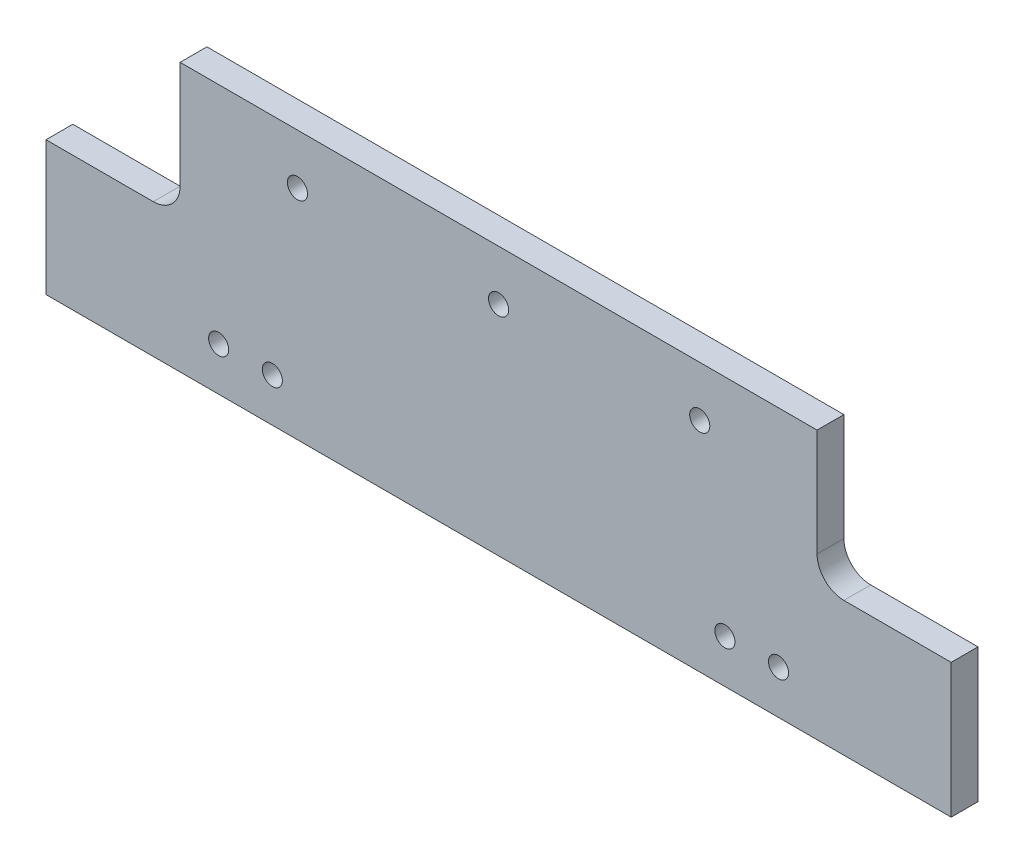
ISO-10303-21;
HEADER;
FILE_DESCRIPTION(('STEP AP214'),'2;1');
FILE_NAME('part.step','',(''),(''),'','','');
FILE_SCHEMA(('AUTOMOTIVE_DESIGN { 1 0 10303 214 1 1 1 1 }'));
ENDSEC;
DATA;
#1=APPLICATION_CONTEXT('core data for automotive mechanical design processes');
#2=APPLICATION_PROTOCOL_DEFINITION('international standard','automotive_design',2000,#1);
#3=PRODUCT_CONTEXT('',#1,'mechanical');
#4=PRODUCT('Part','Part','',(#3));
#5=PRODUCT_RELATED_PRODUCT_CATEGORY('part','',(#4));
#6=PRODUCT_DEFINITION_FORMATION('','',#4);
#7=PRODUCT_DEFINITION_CONTEXT('part definition',#1,'design');
#8=PRODUCT_DEFINITION('design','',#6,#7);
#9=PRODUCT_DEFINITION_SHAPE('','',#8);
#10=(LENGTH_UNIT() NAMED_UNIT(*) SI_UNIT(.MILLI.,.METRE.));
#11=(NAMED_UNIT(*) PLANE_ANGLE_UNIT() SI_UNIT($,.RADIAN.));
#12=(NAMED_UNIT(*) SI_UNIT($,.STERADIAN.) SOLID_ANGLE_UNIT());
#13=UNCERTAINTY_MEASURE_WITH_UNIT(LENGTH_MEASURE(1.E-05),#10,'distance_accuracy_value','');
#14=(GEOMETRIC_REPRESENTATION_CONTEXT(3) GLOBAL_UNCERTAINTY_ASSIGNED_CONTEXT((#13)) GLOBAL_UNIT_ASSIGNED_CONTEXT((#10,
#11,#12)) REPRESENTATION_CONTEXT('',''));
#15=CARTESIAN_POINT('',(0.,0.,0.));
#16=DIRECTION('',(0.,0.,1.));
#17=DIRECTION('',(1.,0.,0.));
#18=AXIS2_PLACEMENT_3D('',#15,#16,#17);
#19=CARTESIAN_POINT('',(67.5,20.,4.));
#20=DIRECTION('',(-1.,0.,0.));
#21=DIRECTION('',(0.,0.,1.));
#22=AXIS2_PLACEMENT_3D('',#19,#20,#21);
#23=PLANE('',#22);
#24=DIRECTION('',(0.,1.,0.));
#25=VECTOR('',#24,1.);
#26=CARTESIAN_POINT('',(67.5,20.,0.));
#27=LINE('',#26,#25);
#28=CARTESIAN_POINT('',(67.5,-20.,0.));
#29=VERTEX_POINT('',#28);
#30=CARTESIAN_POINT('',(67.5,0.,0.));
#31=VERTEX_POINT('',#30);
#32=EDGE_CURVE('E146',#29,#31,#27,.T.);
#33=ORIENTED_EDGE('',*,*,#32,.T.);
#34=DIRECTION('',(0.,0.,1.));
#35=VECTOR('',#34,1.);
#36=CARTESIAN_POINT('',(67.5,0.,0.));
#37=LINE('',#36,#35);
#38=CARTESIAN_POINT('',(67.5,0.,4.));
#39=VERTEX_POINT('',#38);
#40=EDGE_CURVE('E220',#31,#39,#37,.T.);
#41=ORIENTED_EDGE('',*,*,#40,.T.);
#42=DIRECTION('',(0.,1.,0.));
#43=VECTOR('',#42,1.);
#44=CARTESIAN_POINT('',(67.5,20.,4.));
#45=LINE('',#44,#43);
#46=CARTESIAN_POINT('',(67.5,-20.,4.));
#47=VERTEX_POINT('',#46);
#48=EDGE_CURVE('E143',#47,#39,#45,.T.);
#49=ORIENTED_EDGE('',*,*,#48,.F.);
#50=DIRECTION('',(0.,0.,-1.));
#51=VECTOR('',#50,1.);
#52=CARTESIAN_POINT('',(67.5,-20.,4.));
#53=LINE('',#52,#51);
#54=EDGE_CURVE('E150',#47,#29,#53,.T.);
#55=ORIENTED_EDGE('',*,*,#54,.T.);
#56=EDGE_LOOP('',(#33,#41,#49,#55));
#57=FACE_BOUND('',#56,.T.);
#58=ADVANCED_FACE('F39',(#57),#23,.F.);
#59=CARTESIAN_POINT('',(-67.5,20.,4.));
#60=DIRECTION('',(0.,-1.,0.));
#61=DIRECTION('',(0.,0.,-1.));
#62=AXIS2_PLACEMENT_3D('',#59,#60,#61);
#63=PLANE('',#62);
#64=DIRECTION('',(-1.,0.,0.));
#65=VECTOR('',#64,1.);
#66=CARTESIAN_POINT('',(-67.5,20.,0.));
#67=LINE('',#66,#65);
#68=CARTESIAN_POINT('',(47.5,20.,0.));
#69=VERTEX_POINT('',#68);
#70=CARTESIAN_POINT('',(-47.5,20.,0.));
#71=VERTEX_POINT('',#70);
#72=EDGE_CURVE('E139',#69,#71,#67,.T.);
#73=ORIENTED_EDGE('',*,*,#72,.T.);
#74=DIRECTION('',(0.,0.,1.));
#75=VECTOR('',#74,1.);
#76=CARTESIAN_POINT('',(-47.5,20.,0.));
#77=LINE('',#76,#75);
#78=CARTESIAN_POINT('',(-47.5,20.,4.));
#79=VERTEX_POINT('',#78);
#80=EDGE_CURVE('E132',#71,#79,#77,.T.);
#81=ORIENTED_EDGE('',*,*,#80,.T.);
#82=DIRECTION('',(-1.,0.,0.));
#83=VECTOR('',#82,1.);
#84=CARTESIAN_POINT('',(-67.5,20.,4.));
#85=LINE('',#84,#83);
#86=CARTESIAN_POINT('',(47.5,20.,4.));
#87=VERTEX_POINT('',#86);
#88=EDGE_CURVE('E181',#87,#79,#85,.T.);
#89=ORIENTED_EDGE('',*,*,#88,.F.);
#90=DIRECTION('',(0.,0.,1.));
#91=VECTOR('',#90,1.);
#92=CARTESIAN_POINT('',(47.5,20.,0.));
#93=LINE('',#92,#91);
#94=EDGE_CURVE('E191',#69,#87,#93,.T.);
#95=ORIENTED_EDGE('',*,*,#94,.F.);
#96=EDGE_LOOP('',(#73,#81,#89,#95));
#97=FACE_BOUND('',#96,.T.);
#98=ADVANCED_FACE('F233',(#97),#63,.F.);
#99=CARTESIAN_POINT('',(-67.5,20.,4.));
#100=DIRECTION('',(1.,0.,0.));
#101=DIRECTION('',(0.,0.,-1.));
#102=AXIS2_PLACEMENT_3D('',#99,#100,#101);
#103=PLANE('',#102);
#104=DIRECTION('',(0.,-1.,0.));
#105=VECTOR('',#104,1.);
#106=CARTESIAN_POINT('',(-67.5,20.,4.));
#107=LINE('',#106,#105);
#108=CARTESIAN_POINT('',(-67.5,0.,4.));
#109=VERTEX_POINT('',#108);
#110=CARTESIAN_POINT('',(-67.5,-20.,4.));
#111=VERTEX_POINT('',#110);
#112=EDGE_CURVE('E130',#109,#111,#107,.T.);
#113=ORIENTED_EDGE('',*,*,#112,.F.);
#114=DIRECTION('',(0.,0.,1.));
#115=VECTOR('',#114,1.);
#116=CARTESIAN_POINT('',(-67.5,0.,0.));
#117=LINE('',#116,#115);
#118=CARTESIAN_POINT('',(-67.5,0.,0.));
#119=VERTEX_POINT('',#118);
#120=EDGE_CURVE('E116',#119,#109,#117,.T.);
#121=ORIENTED_EDGE('',*,*,#120,.F.);
#122=DIRECTION('',(0.,-1.,0.));
#123=VECTOR('',#122,1.);
#124=CARTESIAN_POINT('',(-67.5,20.,0.));
#125=LINE('',#124,#123);
#126=CARTESIAN_POINT('',(-67.5,-20.,0.));
#127=VERTEX_POINT('',#126);
#128=EDGE_CURVE('E128',#119,#127,#125,.T.);
#129=ORIENTED_EDGE('',*,*,#128,.T.);
#130=DIRECTION('',(0.,0.,-1.));
#131=VECTOR('',#130,1.);
#132=CARTESIAN_POINT('',(-67.5,-20.,4.));
#133=LINE('',#132,#131);
#134=EDGE_CURVE('E154',#111,#127,#133,.T.);
#135=ORIENTED_EDGE('',*,*,#134,.F.);
#136=EDGE_LOOP('',(#113,#121,#129,#135));
#137=FACE_BOUND('',#136,.T.);
#138=ADVANCED_FACE('F126',(#137),#103,.F.);
#139=CARTESIAN_POINT('',(-67.5,-20.,4.));
#140=DIRECTION('',(0.,1.,0.));
#141=DIRECTION('',(0.,0.,1.));
#142=AXIS2_PLACEMENT_3D('',#139,#140,#141);
#143=PLANE('',#142);
#144=DIRECTION('',(1.,0.,0.));
#145=VECTOR('',#144,1.);
#146=CARTESIAN_POINT('',(-67.5,-20.,0.));
#147=LINE('',#146,#145);
#148=EDGE_CURVE('E137',#127,#29,#147,.T.);
#149=ORIENTED_EDGE('',*,*,#148,.T.);
#150=ORIENTED_EDGE('',*,*,#54,.F.);
#151=DIRECTION('',(1.,0.,0.));
#152=VECTOR('',#151,1.);
#153=CARTESIAN_POINT('',(-67.5,-20.,4.));
#154=LINE('',#153,#152);
#155=EDGE_CURVE('E155',#111,#47,#154,.T.);
#156=ORIENTED_EDGE('',*,*,#155,.F.);
#157=ORIENTED_EDGE('',*,*,#134,.T.);
#158=EDGE_LOOP('',(#149,#150,#156,#157));
#159=FACE_BOUND('',#158,.T.);
#160=ADVANCED_FACE('F240',(#159),#143,.F.);
#161=CARTESIAN_POINT('',(0.,0.,4.));
#162=DIRECTION('',(0.,0.,1.));
#163=DIRECTION('',(1.,0.,0.));
#164=AXIS2_PLACEMENT_3D('',#161,#162,#163);
#165=PLANE('',#164);
#166=CARTESIAN_POINT('',(-41.75,-13.5,4.));
#167=DIRECTION('',(0.,0.,1.));
#168=DIRECTION('',(1.,0.,0.));
#169=AXIS2_PLACEMENT_3D('',#166,#167,#168);
#170=CIRCLE('',#169,1.5);
#171=CARTESIAN_POINT('',(-40.25,-13.5,4.));
#172=VERTEX_POINT('',#171);
#173=EDGE_CURVE('E333',#172,#172,#170,.T.);
#174=ORIENTED_EDGE('',*,*,#173,.F.);
#175=EDGE_LOOP('',(#174));
#176=FACE_BOUND('',#175,.T.);
#177=CARTESIAN_POINT('',(-33.75,-13.5,4.));
#178=DIRECTION('',(0.,0.,1.));
#179=DIRECTION('',(1.,0.,0.));
#180=AXIS2_PLACEMENT_3D('',#177,#178,#179);
#181=CIRCLE('',#180,1.5);
#182=CARTESIAN_POINT('',(-32.25,-13.5,4.));
#183=VERTEX_POINT('',#182);
#184=EDGE_CURVE('E325',#183,#183,#181,.T.);
#185=ORIENTED_EDGE('',*,*,#184,.F.);
#186=EDGE_LOOP('',(#185));
#187=FACE_BOUND('',#186,.T.);
#188=CARTESIAN_POINT('',(33.75,-13.5,4.));
#189=DIRECTION('',(0.,0.,1.));
#190=DIRECTION('',(-1.,0.,0.));
#191=AXIS2_PLACEMENT_3D('',#188,#189,#190);
#192=CIRCLE('',#191,1.5);
#193=CARTESIAN_POINT('',(32.25,-13.5,4.));
#194=VERTEX_POINT('',#193);
#195=EDGE_CURVE('E317',#194,#194,#192,.T.);
#196=ORIENTED_EDGE('',*,*,#195,.F.);
#197=EDGE_LOOP('',(#196));
#198=FACE_BOUND('',#197,.T.);
#199=CARTESIAN_POINT('',(41.75,-13.5,4.));
#200=DIRECTION('',(0.,0.,1.));
#201=DIRECTION('',(-1.,0.,0.));
#202=AXIS2_PLACEMENT_3D('',#199,#200,#201);
#203=CIRCLE('',#202,1.5);
#204=CARTESIAN_POINT('',(40.25,-13.5,4.));
#205=VERTEX_POINT('',#204);
#206=EDGE_CURVE('E309',#205,#205,#203,.T.);
#207=ORIENTED_EDGE('',*,*,#206,.F.);
#208=EDGE_LOOP('',(#207));
#209=FACE_BOUND('',#208,.T.);
#210=CARTESIAN_POINT('',(30.,12.5,4.));
#211=DIRECTION('',(0.,0.,1.));
#212=DIRECTION('',(-1.,0.,0.));
#213=AXIS2_PLACEMENT_3D('',#210,#211,#212);
#214=CIRCLE('',#213,1.5);
#215=CARTESIAN_POINT('',(28.5,12.5,4.));
#216=VERTEX_POINT('',#215);
#217=EDGE_CURVE('E293',#216,#216,#214,.T.);
#218=ORIENTED_EDGE('',*,*,#217,.F.);
#219=EDGE_LOOP('',(#218));
#220=FACE_BOUND('',#219,.T.);
#221=CARTESIAN_POINT('',(-30.,12.5,4.));
#222=DIRECTION('',(0.,0.,1.));
#223=DIRECTION('',(1.,0.,0.));
#224=AXIS2_PLACEMENT_3D('',#221,#222,#223);
#225=CIRCLE('',#224,1.5);
#226=CARTESIAN_POINT('',(-28.5,12.5,4.));
#227=VERTEX_POINT('',#226);
#228=EDGE_CURVE('E302',#227,#227,#225,.T.);
#229=ORIENTED_EDGE('',*,*,#228,.F.);
#230=EDGE_LOOP('',(#229));
#231=FACE_BOUND('',#230,.T.);
#232=CARTESIAN_POINT('',(0.,12.5,4.));
#233=DIRECTION('',(0.,0.,1.));
#234=DIRECTION('',(1.,0.,0.));
#235=AXIS2_PLACEMENT_3D('',#232,#233,#234);
#236=CIRCLE('',#235,1.5);
#237=CARTESIAN_POINT('',(1.5,12.5,4.));
#238=VERTEX_POINT('',#237);
#239=EDGE_CURVE('E285',#238,#238,#236,.T.);
#240=ORIENTED_EDGE('',*,*,#239,.F.);
#241=EDGE_LOOP('',(#240));
#242=FACE_BOUND('',#241,.T.);
#243=DIRECTION('',(0.,1.,0.));
#244=VECTOR('',#243,1.);
#245=CARTESIAN_POINT('',(-47.5,20.,4.));
#246=LINE('',#245,#244);
#247=CARTESIAN_POINT('',(-47.5,4.,4.));
#248=VERTEX_POINT('',#247);
#249=EDGE_CURVE('E122',#248,#79,#246,.T.);
#250=ORIENTED_EDGE('',*,*,#249,.F.);
#251=CARTESIAN_POINT('',(-51.5,4.,4.));
#252=DIRECTION('',(0.,0.,1.));
#253=DIRECTION('',(1.,0.,0.));
#254=AXIS2_PLACEMENT_3D('',#251,#252,#253);
#255=CIRCLE('',#254,4.);
#256=CARTESIAN_POINT('',(-51.5,0.,4.));
#257=VERTEX_POINT('',#256);
#258=EDGE_CURVE('E48',#248,#257,#255,.F.);
#259=ORIENTED_EDGE('',*,*,#258,.T.);
#260=DIRECTION('',(1.,0.,0.));
#261=VECTOR('',#260,1.);
#262=CARTESIAN_POINT('',(-67.5,0.,4.));
#263=LINE('',#262,#261);
#264=EDGE_CURVE('E222',#109,#257,#263,.T.);
#265=ORIENTED_EDGE('',*,*,#264,.F.);
#266=ORIENTED_EDGE('',*,*,#112,.T.);
#267=ORIENTED_EDGE('',*,*,#155,.T.);
#268=ORIENTED_EDGE('',*,*,#48,.T.);
#269=DIRECTION('',(1.,0.,0.));
#270=VECTOR('',#269,1.);
#271=CARTESIAN_POINT('',(67.5,0.,4.));
#272=LINE('',#271,#270);
#273=CARTESIAN_POINT('',(51.5,0.,4.));
#274=VERTEX_POINT('',#273);
#275=EDGE_CURVE('E211',#274,#39,#272,.T.);
#276=ORIENTED_EDGE('',*,*,#275,.F.);
#277=CARTESIAN_POINT('',(51.5,4.00000000000001,4.));
#278=DIRECTION('',(0.,0.,1.));
#279=DIRECTION('',(1.,0.,0.));
#280=AXIS2_PLACEMENT_3D('',#277,#278,#279);
#281=CIRCLE('',#280,4.);
#282=CARTESIAN_POINT('',(47.5,4.00000000000001,4.));
#283=VERTEX_POINT('',#282);
#284=EDGE_CURVE('E171',#274,#283,#281,.F.);
#285=ORIENTED_EDGE('',*,*,#284,.T.);
#286=DIRECTION('',(0.,-1.,0.));
#287=VECTOR('',#286,1.);
#288=CARTESIAN_POINT('',(47.5,20.,4.));
#289=LINE('',#288,#287);
#290=EDGE_CURVE('E214',#87,#283,#289,.T.);
#291=ORIENTED_EDGE('',*,*,#290,.F.);
#292=ORIENTED_EDGE('',*,*,#88,.T.);
#293=EDGE_LOOP('',(#250,#259,#265,#266,#267,#268,#276,#285,#291,#292));
#294=FACE_BOUND('',#293,.T.);
#295=ADVANCED_FACE('F232',(#176,#187,#198,#209,#220,#231,#242,#294),#165,.T.);
#296=CARTESIAN_POINT('',(0.,0.,0.));
#297=DIRECTION('',(0.,0.,1.));
#298=DIRECTION('',(1.,0.,0.));
#299=AXIS2_PLACEMENT_3D('',#296,#297,#298);
#300=PLANE('',#299);
#301=CARTESIAN_POINT('',(-41.75,-13.5,0.));
#302=DIRECTION('',(0.,0.,1.));
#303=DIRECTION('',(1.,0.,0.));
#304=AXIS2_PLACEMENT_3D('',#301,#302,#303);
#305=CIRCLE('',#304,1.5);
#306=CARTESIAN_POINT('',(-40.25,-13.5,0.));
#307=VERTEX_POINT('',#306);
#308=EDGE_CURVE('E298',#307,#307,#305,.T.);
#309=ORIENTED_EDGE('',*,*,#308,.T.);
#310=EDGE_LOOP('',(#309));
#311=FACE_BOUND('',#310,.T.);
#312=CARTESIAN_POINT('',(-33.75,-13.5,0.));
#313=DIRECTION('',(0.,0.,1.));
#314=DIRECTION('',(1.,0.,0.));
#315=AXIS2_PLACEMENT_3D('',#312,#313,#314);
#316=CIRCLE('',#315,1.5);
#317=CARTESIAN_POINT('',(-32.25,-13.5,0.));
#318=VERTEX_POINT('',#317);
#319=EDGE_CURVE('E329',#318,#318,#316,.T.);
#320=ORIENTED_EDGE('',*,*,#319,.T.);
#321=EDGE_LOOP('',(#320));
#322=FACE_BOUND('',#321,.T.);
#323=CARTESIAN_POINT('',(33.75,-13.5,0.));
#324=DIRECTION('',(0.,0.,1.));
#325=DIRECTION('',(-1.,0.,0.));
#326=AXIS2_PLACEMENT_3D('',#323,#324,#325);
#327=CIRCLE('',#326,1.5);
#328=CARTESIAN_POINT('',(32.25,-13.5,0.));
#329=VERTEX_POINT('',#328);
#330=EDGE_CURVE('E321',#329,#329,#327,.T.);
#331=ORIENTED_EDGE('',*,*,#330,.T.);
#332=EDGE_LOOP('',(#331));
#333=FACE_BOUND('',#332,.T.);
#334=CARTESIAN_POINT('',(41.75,-13.5,0.));
#335=DIRECTION('',(0.,0.,1.));
#336=DIRECTION('',(-1.,0.,0.));
#337=AXIS2_PLACEMENT_3D('',#334,#335,#336);
#338=CIRCLE('',#337,1.5);
#339=CARTESIAN_POINT('',(40.25,-13.5,0.));
#340=VERTEX_POINT('',#339);
#341=EDGE_CURVE('E313',#340,#340,#338,.T.);
#342=ORIENTED_EDGE('',*,*,#341,.T.);
#343=EDGE_LOOP('',(#342));
#344=FACE_BOUND('',#343,.T.);
#345=CARTESIAN_POINT('',(30.,12.5,0.));
#346=DIRECTION('',(0.,0.,1.));
#347=DIRECTION('',(-1.,0.,0.));
#348=AXIS2_PLACEMENT_3D('',#345,#346,#347);
#349=CIRCLE('',#348,1.5);
#350=CARTESIAN_POINT('',(28.5,12.5,0.));
#351=VERTEX_POINT('',#350);
#352=EDGE_CURVE('E297',#351,#351,#349,.T.);
#353=ORIENTED_EDGE('',*,*,#352,.T.);
#354=EDGE_LOOP('',(#353));
#355=FACE_BOUND('',#354,.T.);
#356=CARTESIAN_POINT('',(-30.,12.5,0.));
#357=DIRECTION('',(0.,0.,1.));
#358=DIRECTION('',(1.,0.,0.));
#359=AXIS2_PLACEMENT_3D('',#356,#357,#358);
#360=CIRCLE('',#359,1.5);
#361=CARTESIAN_POINT('',(-28.5,12.5,0.));
#362=VERTEX_POINT('',#361);
#363=EDGE_CURVE('E289',#362,#362,#360,.T.);
#364=ORIENTED_EDGE('',*,*,#363,.T.);
#365=EDGE_LOOP('',(#364));
#366=FACE_BOUND('',#365,.T.);
#367=CARTESIAN_POINT('',(0.,12.5,0.));
#368=DIRECTION('',(0.,0.,1.));
#369=DIRECTION('',(1.,0.,0.));
#370=AXIS2_PLACEMENT_3D('',#367,#368,#369);
#371=CIRCLE('',#370,1.5);
#372=CARTESIAN_POINT('',(1.5,12.5,0.));
#373=VERTEX_POINT('',#372);
#374=EDGE_CURVE('E218',#373,#373,#371,.T.);
#375=ORIENTED_EDGE('',*,*,#374,.T.);
#376=EDGE_LOOP('',(#375));
#377=FACE_BOUND('',#376,.T.);
#378=DIRECTION('',(1.,0.,0.));
#379=VECTOR('',#378,1.);
#380=CARTESIAN_POINT('',(-67.5,0.,0.));
#381=LINE('',#380,#379);
#382=CARTESIAN_POINT('',(-51.5,0.,0.));
#383=VERTEX_POINT('',#382);
#384=EDGE_CURVE('E113',#119,#383,#381,.T.);
#385=ORIENTED_EDGE('',*,*,#384,.T.);
#386=CARTESIAN_POINT('',(-51.5,4.,0.));
#387=DIRECTION('',(0.,0.,1.));
#388=DIRECTION('',(1.,0.,0.));
#389=AXIS2_PLACEMENT_3D('',#386,#387,#388);
#390=CIRCLE('',#389,4.);
#391=CARTESIAN_POINT('',(-47.5,4.,0.));
#392=VERTEX_POINT('',#391);
#393=EDGE_CURVE('E11',#383,#392,#390,.T.);
#394=ORIENTED_EDGE('',*,*,#393,.T.);
#395=DIRECTION('',(0.,1.,0.));
#396=VECTOR('',#395,1.);
#397=CARTESIAN_POINT('',(-47.5,20.,0.));
#398=LINE('',#397,#396);
#399=EDGE_CURVE('E121',#392,#71,#398,.T.);
#400=ORIENTED_EDGE('',*,*,#399,.T.);
#401=ORIENTED_EDGE('',*,*,#72,.F.);
#402=DIRECTION('',(0.,-1.,0.));
#403=VECTOR('',#402,1.);
#404=CARTESIAN_POINT('',(47.5,20.,0.));
#405=LINE('',#404,#403);
#406=CARTESIAN_POINT('',(47.5,4.00000000000001,0.));
#407=VERTEX_POINT('',#406);
#408=EDGE_CURVE('E206',#69,#407,#405,.T.);
#409=ORIENTED_EDGE('',*,*,#408,.T.);
#410=CARTESIAN_POINT('',(51.5,4.00000000000001,0.));
#411=DIRECTION('',(0.,0.,1.));
#412=DIRECTION('',(1.,0.,0.));
#413=AXIS2_PLACEMENT_3D('',#410,#411,#412);
#414=CIRCLE('',#413,4.);
#415=CARTESIAN_POINT('',(51.5,0.,0.));
#416=VERTEX_POINT('',#415);
#417=EDGE_CURVE('E174',#407,#416,#414,.T.);
#418=ORIENTED_EDGE('',*,*,#417,.T.);
#419=DIRECTION('',(1.,0.,0.));
#420=VECTOR('',#419,1.);
#421=CARTESIAN_POINT('',(67.5,0.,0.));
#422=LINE('',#421,#420);
#423=EDGE_CURVE('E210',#416,#31,#422,.T.);
#424=ORIENTED_EDGE('',*,*,#423,.T.);
#425=ORIENTED_EDGE('',*,*,#32,.F.);
#426=ORIENTED_EDGE('',*,*,#148,.F.);
#427=ORIENTED_EDGE('',*,*,#128,.F.);
#428=EDGE_LOOP('',(#385,#394,#400,#401,#409,#418,#424,#425,#426,#427));
#429=FACE_BOUND('',#428,.T.);
#430=ADVANCED_FACE('F135',(#311,#322,#333,#344,#355,#366,#377,#429),#300,.F.);
#431=CARTESIAN_POINT('',(67.5,0.,0.));
#432=DIRECTION('',(0.,-1.,0.));
#433=DIRECTION('',(1.,0.,0.));
#434=AXIS2_PLACEMENT_3D('',#431,#432,#433);
#435=PLANE('',#434);
#436=ORIENTED_EDGE('',*,*,#423,.F.);
#437=DIRECTION('',(0.,0.,1.));
#438=VECTOR('',#437,1.);
#439=CARTESIAN_POINT('',(51.5,0.,4.));
#440=LINE('',#439,#438);
#441=EDGE_CURVE('E158',#416,#274,#440,.T.);
#442=ORIENTED_EDGE('',*,*,#441,.T.);
#443=ORIENTED_EDGE('',*,*,#275,.T.);
#444=ORIENTED_EDGE('',*,*,#40,.F.);
#445=EDGE_LOOP('',(#436,#442,#443,#444));
#446=FACE_BOUND('',#445,.T.);
#447=ADVANCED_FACE('F259',(#446),#435,.F.);
#448=CARTESIAN_POINT('',(47.5,20.,0.));
#449=DIRECTION('',(-1.,0.,0.));
#450=DIRECTION('',(0.,-1.,0.));
#451=AXIS2_PLACEMENT_3D('',#448,#449,#450);
#452=PLANE('',#451);
#453=ORIENTED_EDGE('',*,*,#290,.T.);
#454=DIRECTION('',(0.,0.,1.));
#455=VECTOR('',#454,1.);
#456=CARTESIAN_POINT('',(47.5,4.00000000000001,0.));
#457=LINE('',#456,#455);
#458=EDGE_CURVE('E162',#283,#407,#457,.F.);
#459=ORIENTED_EDGE('',*,*,#458,.T.);
#460=ORIENTED_EDGE('',*,*,#408,.F.);
#461=ORIENTED_EDGE('',*,*,#94,.T.);
#462=EDGE_LOOP('',(#453,#459,#460,#461));
#463=FACE_BOUND('',#462,.T.);
#464=ADVANCED_FACE('F229',(#463),#452,.F.);
#465=CARTESIAN_POINT('',(-47.5,20.,0.));
#466=DIRECTION('',(1.,0.,0.));
#467=DIRECTION('',(0.,1.,0.));
#468=AXIS2_PLACEMENT_3D('',#465,#466,#467);
#469=PLANE('',#468);
#470=ORIENTED_EDGE('',*,*,#399,.F.);
#471=DIRECTION('',(0.,0.,1.));
#472=VECTOR('',#471,1.);
#473=CARTESIAN_POINT('',(-47.5,4.,4.));
#474=LINE('',#473,#472);
#475=EDGE_CURVE('E165',#392,#248,#474,.T.);
#476=ORIENTED_EDGE('',*,*,#475,.T.);
#477=ORIENTED_EDGE('',*,*,#249,.T.);
#478=ORIENTED_EDGE('',*,*,#80,.F.);
#479=EDGE_LOOP('',(#470,#476,#477,#478));
#480=FACE_BOUND('',#479,.T.);
#481=ADVANCED_FACE('F253',(#480),#469,.F.);
#482=CARTESIAN_POINT('',(-67.5,0.,0.));
#483=DIRECTION('',(0.,-1.,0.));
#484=DIRECTION('',(1.,0.,0.));
#485=AXIS2_PLACEMENT_3D('',#482,#483,#484);
#486=PLANE('',#485);
#487=ORIENTED_EDGE('',*,*,#264,.T.);
#488=DIRECTION('',(0.,0.,1.));
#489=VECTOR('',#488,1.);
#490=CARTESIAN_POINT('',(-51.5,0.,0.));
#491=LINE('',#490,#489);
#492=EDGE_CURVE('E55',#257,#383,#491,.F.);
#493=ORIENTED_EDGE('',*,*,#492,.T.);
#494=ORIENTED_EDGE('',*,*,#384,.F.);
#495=ORIENTED_EDGE('',*,*,#120,.T.);
#496=EDGE_LOOP('',(#487,#493,#494,#495));
#497=FACE_BOUND('',#496,.T.);
#498=ADVANCED_FACE('F115',(#497),#486,.F.);
#499=CARTESIAN_POINT('',(51.5,4.00000000000001,0.));
#500=DIRECTION('',(0.,0.,-1.));
#501=DIRECTION('',(-1.,0.,0.));
#502=AXIS2_PLACEMENT_3D('',#499,#500,#501);
#503=CYLINDRICAL_SURFACE('',#502,4.);
#504=ORIENTED_EDGE('',*,*,#417,.F.);
#505=ORIENTED_EDGE('',*,*,#458,.F.);
#506=ORIENTED_EDGE('',*,*,#284,.F.);
#507=ORIENTED_EDGE('',*,*,#441,.F.);
#508=EDGE_LOOP('',(#504,#505,#506,#507));
#509=FACE_BOUND('',#508,.T.);
#510=ADVANCED_FACE('F244',(#509),#503,.F.);
#511=CARTESIAN_POINT('',(-51.5,4.,0.));
#512=DIRECTION('',(0.,0.,-1.));
#513=DIRECTION('',(-1.,0.,0.));
#514=AXIS2_PLACEMENT_3D('',#511,#512,#513);
#515=CYLINDRICAL_SURFACE('',#514,4.);
#516=ORIENTED_EDGE('',*,*,#393,.F.);
#517=ORIENTED_EDGE('',*,*,#492,.F.);
#518=ORIENTED_EDGE('',*,*,#258,.F.);
#519=ORIENTED_EDGE('',*,*,#475,.F.);
#520=EDGE_LOOP('',(#516,#517,#518,#519));
#521=FACE_BOUND('',#520,.T.);
#522=ADVANCED_FACE('F41',(#521),#515,.F.);
#523=CARTESIAN_POINT('',(0.,12.5,0.));
#524=DIRECTION('',(0.,0.,1.));
#525=DIRECTION('',(1.,0.,0.));
#526=AXIS2_PLACEMENT_3D('',#523,#524,#525);
#527=CYLINDRICAL_SURFACE('',#526,1.5);
#528=ORIENTED_EDGE('',*,*,#374,.F.);
#529=EDGE_LOOP('',(#528));
#530=FACE_BOUND('',#529,.T.);
#531=ORIENTED_EDGE('',*,*,#239,.T.);
#532=EDGE_LOOP('',(#531));
#533=FACE_BOUND('',#532,.T.);
#534=ADVANCED_FACE('F251',(#530,#533),#527,.F.);
#535=CARTESIAN_POINT('',(-30.,12.5,0.));
#536=DIRECTION('',(0.,0.,1.));
#537=DIRECTION('',(1.,0.,0.));
#538=AXIS2_PLACEMENT_3D('',#535,#536,#537);
#539=CYLINDRICAL_SURFACE('',#538,1.5);
#540=ORIENTED_EDGE('',*,*,#363,.F.);
#541=EDGE_LOOP('',(#540));
#542=FACE_BOUND('',#541,.T.);
#543=ORIENTED_EDGE('',*,*,#228,.T.);
#544=EDGE_LOOP('',(#543));
#545=FACE_BOUND('',#544,.T.);
#546=ADVANCED_FACE('F362',(#542,#545),#539,.F.);
#547=CARTESIAN_POINT('',(30.,12.5,0.));
#548=DIRECTION('',(0.,0.,1.));
#549=DIRECTION('',(1.,0.,0.));
#550=AXIS2_PLACEMENT_3D('',#547,#548,#549);
#551=CYLINDRICAL_SURFACE('',#550,1.5);
#552=ORIENTED_EDGE('',*,*,#352,.F.);
#553=EDGE_LOOP('',(#552));
#554=FACE_BOUND('',#553,.T.);
#555=ORIENTED_EDGE('',*,*,#217,.T.);
#556=EDGE_LOOP('',(#555));
#557=FACE_BOUND('',#556,.T.);
#558=ADVANCED_FACE('F368',(#554,#557),#551,.F.);
#559=CARTESIAN_POINT('',(41.75,-13.5,0.));
#560=DIRECTION('',(0.,0.,1.));
#561=DIRECTION('',(1.,0.,0.));
#562=AXIS2_PLACEMENT_3D('',#559,#560,#561);
#563=CYLINDRICAL_SURFACE('',#562,1.5);
#564=ORIENTED_EDGE('',*,*,#341,.F.);
#565=EDGE_LOOP('',(#564));
#566=FACE_BOUND('',#565,.T.);
#567=ORIENTED_EDGE('',*,*,#206,.T.);
#568=EDGE_LOOP('',(#567));
#569=FACE_BOUND('',#568,.T.);
#570=ADVANCED_FACE('F411',(#566,#569),#563,.F.);
#571=CARTESIAN_POINT('',(33.75,-13.5,0.));
#572=DIRECTION('',(0.,0.,1.));
#573=DIRECTION('',(1.,0.,0.));
#574=AXIS2_PLACEMENT_3D('',#571,#572,#573);
#575=CYLINDRICAL_SURFACE('',#574,1.5);
#576=ORIENTED_EDGE('',*,*,#330,.F.);
#577=EDGE_LOOP('',(#576));
#578=FACE_BOUND('',#577,.T.);
#579=ORIENTED_EDGE('',*,*,#195,.T.);
#580=EDGE_LOOP('',(#579));
#581=FACE_BOUND('',#580,.T.);
#582=ADVANCED_FACE('F434',(#578,#581),#575,.F.);
#583=CARTESIAN_POINT('',(-33.75,-13.5,0.));
#584=DIRECTION('',(0.,0.,1.));
#585=DIRECTION('',(1.,0.,0.));
#586=AXIS2_PLACEMENT_3D('',#583,#584,#585);
#587=CYLINDRICAL_SURFACE('',#586,1.5);
#588=ORIENTED_EDGE('',*,*,#319,.F.);
#589=EDGE_LOOP('',(#588));
#590=FACE_BOUND('',#589,.T.);
#591=ORIENTED_EDGE('',*,*,#184,.T.);
#592=EDGE_LOOP('',(#591));
#593=FACE_BOUND('',#592,.T.);
#594=ADVANCED_FACE('F345',(#590,#593),#587,.F.);
#595=CARTESIAN_POINT('',(-41.75,-13.5,0.));
#596=DIRECTION('',(0.,0.,1.));
#597=DIRECTION('',(1.,0.,0.));
#598=AXIS2_PLACEMENT_3D('',#595,#596,#597);
#599=CYLINDRICAL_SURFACE('',#598,1.5);
#600=ORIENTED_EDGE('',*,*,#308,.F.);
#601=EDGE_LOOP('',(#600));
#602=FACE_BOUND('',#601,.T.);
#603=ORIENTED_EDGE('',*,*,#173,.T.);
#604=EDGE_LOOP('',(#603));
#605=FACE_BOUND('',#604,.T.);
#606=ADVANCED_FACE('F342',(#602,#605),#599,.F.);
#607=CLOSED_SHELL('',(#58,#98,#138,#160,#295,#430,#447,#464,#481,#498,#510,#522,#534,#546,#558,
#570,#582,#594,#606));
#608=MANIFOLD_SOLID_BREP('B2',#607);
#609=ADVANCED_BREP_SHAPE_REPRESENTATION('',(#18,#608),#14);
#610=SHAPE_DEFINITION_REPRESENTATION(#9,#609);
ENDSEC;
END-ISO-10303-21;
